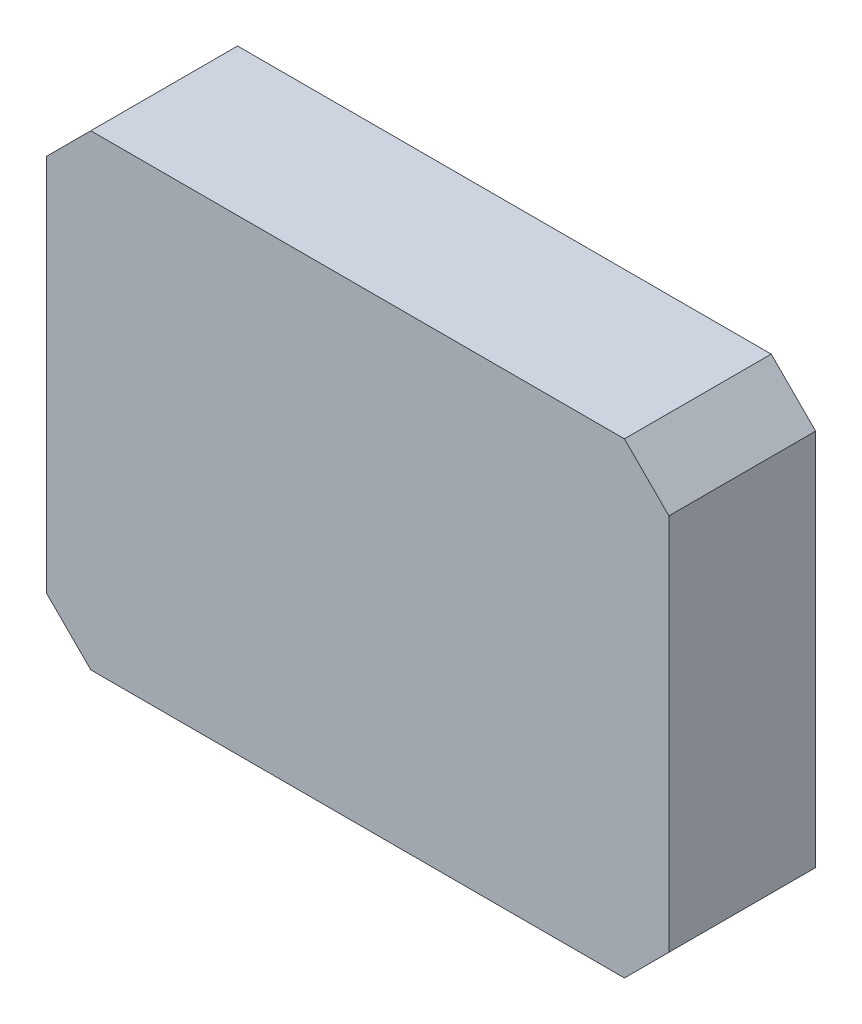
ISO-10303-21;
HEADER;
FILE_DESCRIPTION(('STEP AP214'),'2;1');
FILE_NAME('part.step','',(''),(''),'','','');
FILE_SCHEMA(('AUTOMOTIVE_DESIGN { 1 0 10303 214 1 1 1 1 }'));
ENDSEC;
DATA;
#1=APPLICATION_CONTEXT('core data for automotive mechanical design processes');
#2=APPLICATION_PROTOCOL_DEFINITION('international standard','automotive_design',2000,#1);
#3=PRODUCT_CONTEXT('',#1,'mechanical');
#4=PRODUCT('Part','Part','',(#3));
#5=PRODUCT_RELATED_PRODUCT_CATEGORY('part','',(#4));
#6=PRODUCT_DEFINITION_FORMATION('','',#4);
#7=PRODUCT_DEFINITION_CONTEXT('part definition',#1,'design');
#8=PRODUCT_DEFINITION('design','',#6,#7);
#9=PRODUCT_DEFINITION_SHAPE('','',#8);
#10=(LENGTH_UNIT() NAMED_UNIT(*) SI_UNIT(.MILLI.,.METRE.));
#11=(NAMED_UNIT(*) PLANE_ANGLE_UNIT() SI_UNIT($,.RADIAN.));
#12=(NAMED_UNIT(*) SI_UNIT($,.STERADIAN.) SOLID_ANGLE_UNIT());
#13=UNCERTAINTY_MEASURE_WITH_UNIT(LENGTH_MEASURE(1.E-05),#10,'distance_accuracy_value','');
#14=(GEOMETRIC_REPRESENTATION_CONTEXT(3) GLOBAL_UNCERTAINTY_ASSIGNED_CONTEXT((#13)) GLOBAL_UNIT_ASSIGNED_CONTEXT((#10,
#11,#12)) REPRESENTATION_CONTEXT('',''));
#15=CARTESIAN_POINT('',(0.,0.,0.));
#16=DIRECTION('',(0.,0.,1.));
#17=DIRECTION('',(1.,0.,0.));
#18=AXIS2_PLACEMENT_3D('',#15,#16,#17);
#19=CARTESIAN_POINT('',(-1.20000014,1.05000044,0.66010028));
#20=DIRECTION('',(0.,0.,-1.));
#21=DIRECTION('',(0.,-1.,0.));
#22=AXIS2_PLACEMENT_3D('',#19,#20,#21);
#23=PLANE('',#22);
#24=DIRECTION('',(-0.707106781187048,-0.707106781186048,0.));
#25=VECTOR('',#24,1.);
#26=CARTESIAN_POINT('',(-1.20000014,1.05000044,0.66010028));
#27=LINE('',#26,#25);
#28=CARTESIAN_POINT('',(-1.20000014,1.05000044,0.66010028));
#29=VERTEX_POINT('',#28);
#30=CARTESIAN_POINT('',(-1.39999974,0.85000084,0.66010028));
#31=VERTEX_POINT('',#30);
#32=EDGE_CURVE('E143',#29,#31,#27,.T.);
#33=ORIENTED_EDGE('',*,*,#32,.T.);
#34=DIRECTION('',(0.,-1.,0.));
#35=VECTOR('',#34,1.);
#36=CARTESIAN_POINT('',(-1.39999974,0.85000084,0.66010028));
#37=LINE('',#36,#35);
#38=CARTESIAN_POINT('',(-1.39999974,-0.8499983,0.66010028));
#39=VERTEX_POINT('',#38);
#40=EDGE_CURVE('E153',#31,#39,#37,.T.);
#41=ORIENTED_EDGE('',*,*,#40,.T.);
#42=DIRECTION('',(0.707106781187048,-0.707106781186048,0.));
#43=VECTOR('',#42,1.);
#44=CARTESIAN_POINT('',(-1.39999974,-0.8499983,0.66010028));
#45=LINE('',#44,#43);
#46=CARTESIAN_POINT('',(-1.20000014,-1.0499979,0.66010028));
#47=VERTEX_POINT('',#46);
#48=EDGE_CURVE('E162',#39,#47,#45,.T.);
#49=ORIENTED_EDGE('',*,*,#48,.T.);
#50=DIRECTION('',(1.,0.,0.));
#51=VECTOR('',#50,1.);
#52=CARTESIAN_POINT('',(-1.20000014,-1.0499979,0.66010028));
#53=LINE('',#52,#51);
#54=CARTESIAN_POINT('',(1.20000014,-1.0499979,0.66010028));
#55=VERTEX_POINT('',#54);
#56=EDGE_CURVE('E148',#47,#55,#53,.T.);
#57=ORIENTED_EDGE('',*,*,#56,.T.);
#58=DIRECTION('',(0.707106781187048,0.707106781186048,0.));
#59=VECTOR('',#58,1.);
#60=CARTESIAN_POINT('',(1.20000014,-1.0499979,0.66010028));
#61=LINE('',#60,#59);
#62=CARTESIAN_POINT('',(1.39999974,-0.8499983,0.66010028));
#63=VERTEX_POINT('',#62);
#64=EDGE_CURVE('E72',#55,#63,#61,.T.);
#65=ORIENTED_EDGE('',*,*,#64,.T.);
#66=DIRECTION('',(0.,1.,0.));
#67=VECTOR('',#66,1.);
#68=CARTESIAN_POINT('',(1.39999974,-0.8499983,0.66010028));
#69=LINE('',#68,#67);
#70=CARTESIAN_POINT('',(1.39999974,0.85000084,0.66010028));
#71=VERTEX_POINT('',#70);
#72=EDGE_CURVE('E116',#63,#71,#69,.T.);
#73=ORIENTED_EDGE('',*,*,#72,.T.);
#74=DIRECTION('',(-0.707106781187048,0.707106781186048,0.));
#75=VECTOR('',#74,1.);
#76=CARTESIAN_POINT('',(1.39999974,0.85000084,0.66010028));
#77=LINE('',#76,#75);
#78=CARTESIAN_POINT('',(1.20000014,1.05000044,0.66010028));
#79=VERTEX_POINT('',#78);
#80=EDGE_CURVE('E20',#71,#79,#77,.T.);
#81=ORIENTED_EDGE('',*,*,#80,.T.);
#82=DIRECTION('',(-1.,0.,0.));
#83=VECTOR('',#82,1.);
#84=CARTESIAN_POINT('',(1.20000014,1.05000044,0.66010028));
#85=LINE('',#84,#83);
#86=EDGE_CURVE('E11',#79,#29,#85,.T.);
#87=ORIENTED_EDGE('',*,*,#86,.T.);
#88=EDGE_LOOP('',(#33,#41,#49,#57,#65,#73,#81,#87));
#89=FACE_BOUND('',#88,.T.);
#90=ADVANCED_FACE('F16',(#89),#23,.F.);
#91=CARTESIAN_POINT('',(-1.20000014,1.05000044,0.));
#92=DIRECTION('',(0.,0.,-1.));
#93=DIRECTION('',(0.,-1.,0.));
#94=AXIS2_PLACEMENT_3D('',#91,#92,#93);
#95=PLANE('',#94);
#96=DIRECTION('',(-1.,0.,0.));
#97=VECTOR('',#96,1.);
#98=CARTESIAN_POINT('',(1.20000014,1.05000044,0.));
#99=LINE('',#98,#97);
#100=CARTESIAN_POINT('',(1.20000014,1.05000044,0.));
#101=VERTEX_POINT('',#100);
#102=CARTESIAN_POINT('',(-1.20000014,1.05000044,0.));
#103=VERTEX_POINT('',#102);
#104=EDGE_CURVE('E27',#101,#103,#99,.T.);
#105=ORIENTED_EDGE('',*,*,#104,.F.);
#106=DIRECTION('',(-0.707106781187048,0.707106781186048,0.));
#107=VECTOR('',#106,1.);
#108=CARTESIAN_POINT('',(1.39999974,0.85000084,0.));
#109=LINE('',#108,#107);
#110=CARTESIAN_POINT('',(1.39999974,0.85000084,0.));
#111=VERTEX_POINT('',#110);
#112=EDGE_CURVE('E120',#111,#101,#109,.T.);
#113=ORIENTED_EDGE('',*,*,#112,.F.);
#114=DIRECTION('',(0.,1.,0.));
#115=VECTOR('',#114,1.);
#116=CARTESIAN_POINT('',(1.39999974,-0.8499983,0.));
#117=LINE('',#116,#115);
#118=CARTESIAN_POINT('',(1.39999974,-0.8499983,0.));
#119=VERTEX_POINT('',#118);
#120=EDGE_CURVE('E124',#119,#111,#117,.T.);
#121=ORIENTED_EDGE('',*,*,#120,.F.);
#122=DIRECTION('',(0.707106781187048,0.707106781186048,0.));
#123=VECTOR('',#122,1.);
#124=CARTESIAN_POINT('',(1.20000014,-1.0499979,0.));
#125=LINE('',#124,#123);
#126=CARTESIAN_POINT('',(1.20000014,-1.0499979,0.));
#127=VERTEX_POINT('',#126);
#128=EDGE_CURVE('E83',#127,#119,#125,.T.);
#129=ORIENTED_EDGE('',*,*,#128,.F.);
#130=DIRECTION('',(1.,0.,0.));
#131=VECTOR('',#130,1.);
#132=CARTESIAN_POINT('',(-1.20000014,-1.0499979,0.));
#133=LINE('',#132,#131);
#134=CARTESIAN_POINT('',(-1.20000014,-1.0499979,0.));
#135=VERTEX_POINT('',#134);
#136=EDGE_CURVE('E166',#135,#127,#133,.T.);
#137=ORIENTED_EDGE('',*,*,#136,.F.);
#138=DIRECTION('',(0.707106781187048,-0.707106781186048,0.));
#139=VECTOR('',#138,1.);
#140=CARTESIAN_POINT('',(-1.39999974,-0.8499983,0.));
#141=LINE('',#140,#139);
#142=CARTESIAN_POINT('',(-1.39999974,-0.8499983,0.));
#143=VERTEX_POINT('',#142);
#144=EDGE_CURVE('E157',#143,#135,#141,.T.);
#145=ORIENTED_EDGE('',*,*,#144,.F.);
#146=DIRECTION('',(0.,-1.,0.));
#147=VECTOR('',#146,1.);
#148=CARTESIAN_POINT('',(-1.39999974,0.85000084,0.));
#149=LINE('',#148,#147);
#150=CARTESIAN_POINT('',(-1.39999974,0.85000084,0.));
#151=VERTEX_POINT('',#150);
#152=EDGE_CURVE('E97',#151,#143,#149,.T.);
#153=ORIENTED_EDGE('',*,*,#152,.F.);
#154=DIRECTION('',(-0.707106781187048,-0.707106781186048,0.));
#155=VECTOR('',#154,1.);
#156=CARTESIAN_POINT('',(-1.20000014,1.05000044,0.));
#157=LINE('',#156,#155);
#158=EDGE_CURVE('E184',#103,#151,#157,.T.);
#159=ORIENTED_EDGE('',*,*,#158,.F.);
#160=EDGE_LOOP('',(#105,#113,#121,#129,#137,#145,#153,#159));
#161=FACE_BOUND('',#160,.T.);
#162=ADVANCED_FACE('F122',(#161),#95,.T.);
#163=CARTESIAN_POINT('',(1.20000014,1.05000044,0.));
#164=DIRECTION('',(0.,-1.,0.));
#165=DIRECTION('',(0.,0.,-1.));
#166=AXIS2_PLACEMENT_3D('',#163,#164,#165);
#167=PLANE('',#166);
#168=ORIENTED_EDGE('',*,*,#104,.T.);
#169=DIRECTION('',(0.,0.,1.));
#170=VECTOR('',#169,1.);
#171=CARTESIAN_POINT('',(-1.20000014,1.05000044,0.));
#172=LINE('',#171,#170);
#173=EDGE_CURVE('E169',#103,#29,#172,.T.);
#174=ORIENTED_EDGE('',*,*,#173,.T.);
#175=ORIENTED_EDGE('',*,*,#86,.F.);
#176=DIRECTION('',(0.,0.,1.));
#177=VECTOR('',#176,1.);
#178=CARTESIAN_POINT('',(1.20000014,1.05000044,0.));
#179=LINE('',#178,#177);
#180=EDGE_CURVE('E128',#101,#79,#179,.T.);
#181=ORIENTED_EDGE('',*,*,#180,.F.);
#182=EDGE_LOOP('',(#168,#174,#175,#181));
#183=FACE_BOUND('',#182,.T.);
#184=ADVANCED_FACE('F320',(#183),#167,.F.);
#185=CARTESIAN_POINT('',(1.39999974,0.85000084,0.));
#186=DIRECTION('',(-0.707106781186048,-0.707106781187048,0.));
#187=DIRECTION('',(-0.707106781187048,0.707106781186048,0.));
#188=AXIS2_PLACEMENT_3D('',#185,#186,#187);
#189=PLANE('',#188);
#190=ORIENTED_EDGE('',*,*,#112,.T.);
#191=ORIENTED_EDGE('',*,*,#180,.T.);
#192=ORIENTED_EDGE('',*,*,#80,.F.);
#193=DIRECTION('',(0.,0.,1.));
#194=VECTOR('',#193,1.);
#195=CARTESIAN_POINT('',(1.39999974,0.85000084,0.));
#196=LINE('',#195,#194);
#197=EDGE_CURVE('E129',#111,#71,#196,.T.);
#198=ORIENTED_EDGE('',*,*,#197,.F.);
#199=EDGE_LOOP('',(#190,#191,#192,#198));
#200=FACE_BOUND('',#199,.T.);
#201=ADVANCED_FACE('F130',(#200),#189,.F.);
#202=CARTESIAN_POINT('',(1.39999974,-0.8499983,0.));
#203=DIRECTION('',(-1.,0.,0.));
#204=DIRECTION('',(0.,0.,1.));
#205=AXIS2_PLACEMENT_3D('',#202,#203,#204);
#206=PLANE('',#205);
#207=ORIENTED_EDGE('',*,*,#120,.T.);
#208=ORIENTED_EDGE('',*,*,#197,.T.);
#209=ORIENTED_EDGE('',*,*,#72,.F.);
#210=DIRECTION('',(0.,0.,1.));
#211=VECTOR('',#210,1.);
#212=CARTESIAN_POINT('',(1.39999974,-0.8499983,0.));
#213=LINE('',#212,#211);
#214=EDGE_CURVE('E134',#119,#63,#213,.T.);
#215=ORIENTED_EDGE('',*,*,#214,.F.);
#216=EDGE_LOOP('',(#207,#208,#209,#215));
#217=FACE_BOUND('',#216,.T.);
#218=ADVANCED_FACE('F133',(#217),#206,.F.);
#219=CARTESIAN_POINT('',(1.20000014,-1.0499979,0.));
#220=DIRECTION('',(-0.707106781186048,0.707106781187048,0.));
#221=DIRECTION('',(0.,0.,1.));
#222=AXIS2_PLACEMENT_3D('',#219,#220,#221);
#223=PLANE('',#222);
#224=ORIENTED_EDGE('',*,*,#128,.T.);
#225=ORIENTED_EDGE('',*,*,#214,.T.);
#226=ORIENTED_EDGE('',*,*,#64,.F.);
#227=DIRECTION('',(0.,0.,1.));
#228=VECTOR('',#227,1.);
#229=CARTESIAN_POINT('',(1.20000014,-1.0499979,0.));
#230=LINE('',#229,#228);
#231=EDGE_CURVE('E199',#127,#55,#230,.T.);
#232=ORIENTED_EDGE('',*,*,#231,.F.);
#233=EDGE_LOOP('',(#224,#225,#226,#232));
#234=FACE_BOUND('',#233,.T.);
#235=ADVANCED_FACE('F212',(#234),#223,.F.);
#236=CARTESIAN_POINT('',(-1.20000014,-1.0499979,0.));
#237=DIRECTION('',(0.,1.,0.));
#238=DIRECTION('',(1.,0.,0.));
#239=AXIS2_PLACEMENT_3D('',#236,#237,#238);
#240=PLANE('',#239);
#241=ORIENTED_EDGE('',*,*,#136,.T.);
#242=ORIENTED_EDGE('',*,*,#231,.T.);
#243=ORIENTED_EDGE('',*,*,#56,.F.);
#244=DIRECTION('',(0.,0.,1.));
#245=VECTOR('',#244,1.);
#246=CARTESIAN_POINT('',(-1.20000014,-1.0499979,0.));
#247=LINE('',#246,#245);
#248=EDGE_CURVE('E161',#135,#47,#247,.T.);
#249=ORIENTED_EDGE('',*,*,#248,.F.);
#250=EDGE_LOOP('',(#241,#242,#243,#249));
#251=FACE_BOUND('',#250,.T.);
#252=ADVANCED_FACE('F216',(#251),#240,.F.);
#253=CARTESIAN_POINT('',(-1.39999974,-0.8499983,0.));
#254=DIRECTION('',(0.707106781186048,0.707106781187048,0.));
#255=DIRECTION('',(0.,0.,-1.));
#256=AXIS2_PLACEMENT_3D('',#253,#254,#255);
#257=PLANE('',#256);
#258=ORIENTED_EDGE('',*,*,#144,.T.);
#259=ORIENTED_EDGE('',*,*,#248,.T.);
#260=ORIENTED_EDGE('',*,*,#48,.F.);
#261=DIRECTION('',(0.,0.,1.));
#262=VECTOR('',#261,1.);
#263=CARTESIAN_POINT('',(-1.39999974,-0.8499983,0.));
#264=LINE('',#263,#262);
#265=EDGE_CURVE('E149',#143,#39,#264,.T.);
#266=ORIENTED_EDGE('',*,*,#265,.F.);
#267=EDGE_LOOP('',(#258,#259,#260,#266));
#268=FACE_BOUND('',#267,.T.);
#269=ADVANCED_FACE('F272',(#268),#257,.F.);
#270=CARTESIAN_POINT('',(-1.39999974,0.85000084,0.));
#271=DIRECTION('',(1.,0.,0.));
#272=DIRECTION('',(0.,1.,0.));
#273=AXIS2_PLACEMENT_3D('',#270,#271,#272);
#274=PLANE('',#273);
#275=ORIENTED_EDGE('',*,*,#152,.T.);
#276=ORIENTED_EDGE('',*,*,#265,.T.);
#277=ORIENTED_EDGE('',*,*,#40,.F.);
#278=DIRECTION('',(0.,0.,1.));
#279=VECTOR('',#278,1.);
#280=CARTESIAN_POINT('',(-1.39999974,0.85000084,0.));
#281=LINE('',#280,#279);
#282=EDGE_CURVE('E178',#151,#31,#281,.T.);
#283=ORIENTED_EDGE('',*,*,#282,.F.);
#284=EDGE_LOOP('',(#275,#276,#277,#283));
#285=FACE_BOUND('',#284,.T.);
#286=ADVANCED_FACE('F261',(#285),#274,.F.);
#287=CARTESIAN_POINT('',(-1.20000014,1.05000044,0.));
#288=DIRECTION('',(0.707106781186048,-0.707106781187048,0.));
#289=DIRECTION('',(0.,0.,-1.));
#290=AXIS2_PLACEMENT_3D('',#287,#288,#289);
#291=PLANE('',#290);
#292=ORIENTED_EDGE('',*,*,#158,.T.);
#293=ORIENTED_EDGE('',*,*,#282,.T.);
#294=ORIENTED_EDGE('',*,*,#32,.F.);
#295=ORIENTED_EDGE('',*,*,#173,.F.);
#296=EDGE_LOOP('',(#292,#293,#294,#295));
#297=FACE_BOUND('',#296,.T.);
#298=ADVANCED_FACE('F18',(#297),#291,.F.);
#299=CLOSED_SHELL('',(#90,#162,#184,#201,#218,#235,#252,#269,#286,#298));
#300=MANIFOLD_SOLID_BREP('B1',#299);
#301=ADVANCED_BREP_SHAPE_REPRESENTATION('',(#18,#300),#14);
#302=SHAPE_DEFINITION_REPRESENTATION(#9,#301);
ENDSEC;
END-ISO-10303-21;
